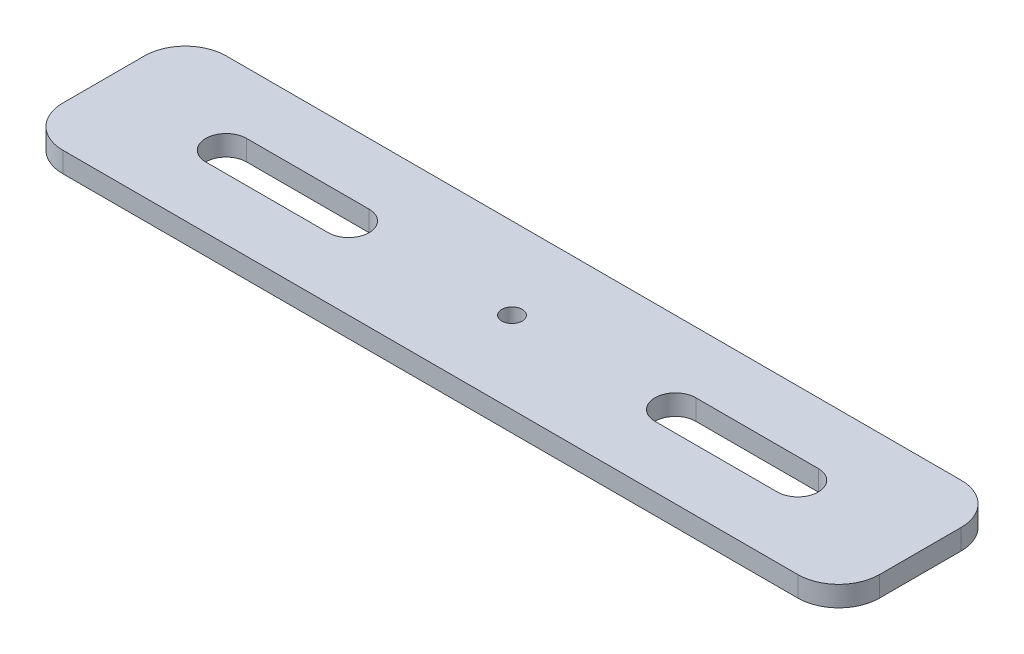
ISO-10303-21;
HEADER;
FILE_DESCRIPTION(('STEP AP214'),'2;1');
FILE_NAME('part.step','',(''),(''),'','','');
FILE_SCHEMA(('AUTOMOTIVE_DESIGN { 1 0 10303 214 1 1 1 1 }'));
ENDSEC;
DATA;
#1=APPLICATION_CONTEXT('core data for automotive mechanical design processes');
#2=APPLICATION_PROTOCOL_DEFINITION('international standard','automotive_design',2000,#1);
#3=PRODUCT_CONTEXT('',#1,'mechanical');
#4=PRODUCT('Part','Part','',(#3));
#5=PRODUCT_RELATED_PRODUCT_CATEGORY('part','',(#4));
#6=PRODUCT_DEFINITION_FORMATION('','',#4);
#7=PRODUCT_DEFINITION_CONTEXT('part definition',#1,'design');
#8=PRODUCT_DEFINITION('design','',#6,#7);
#9=PRODUCT_DEFINITION_SHAPE('','',#8);
#10=(LENGTH_UNIT() NAMED_UNIT(*) SI_UNIT(.MILLI.,.METRE.));
#11=(NAMED_UNIT(*) PLANE_ANGLE_UNIT() SI_UNIT($,.RADIAN.));
#12=(NAMED_UNIT(*) SI_UNIT($,.STERADIAN.) SOLID_ANGLE_UNIT());
#13=UNCERTAINTY_MEASURE_WITH_UNIT(LENGTH_MEASURE(1.E-05),#10,'distance_accuracy_value','');
#14=(GEOMETRIC_REPRESENTATION_CONTEXT(3) GLOBAL_UNCERTAINTY_ASSIGNED_CONTEXT((#13)) GLOBAL_UNIT_ASSIGNED_CONTEXT((#10,
#11,#12)) REPRESENTATION_CONTEXT('',''));
#15=CARTESIAN_POINT('',(0.,0.,0.));
#16=DIRECTION('',(0.,0.,1.));
#17=DIRECTION('',(1.,0.,0.));
#18=AXIS2_PLACEMENT_3D('',#15,#16,#17);
#19=CARTESIAN_POINT('',(70.,5.,0.));
#20=DIRECTION('',(0.,-1.,0.));
#21=DIRECTION('',(0.,0.,-1.));
#22=AXIS2_PLACEMENT_3D('',#19,#20,#21);
#23=CYLINDRICAL_SURFACE('',#22,5.);
#24=CARTESIAN_POINT('',(70.,0.,0.));
#25=DIRECTION('',(0.,1.,0.));
#26=DIRECTION('',(0.,0.,1.));
#27=AXIS2_PLACEMENT_3D('',#24,#25,#26);
#28=CIRCLE('',#27,5.);
#29=CARTESIAN_POINT('',(70.,0.,5.));
#30=VERTEX_POINT('',#29);
#31=CARTESIAN_POINT('',(70.,0.,-5.));
#32=VERTEX_POINT('',#31);
#33=EDGE_CURVE('E240',#30,#32,#28,.T.);
#34=ORIENTED_EDGE('',*,*,#33,.F.);
#35=DIRECTION('',(0.,-1.,0.));
#36=VECTOR('',#35,1.);
#37=CARTESIAN_POINT('',(70.,5.,5.));
#38=LINE('',#37,#36);
#39=CARTESIAN_POINT('',(70.,5.,5.));
#40=VERTEX_POINT('',#39);
#41=EDGE_CURVE('E11',#40,#30,#38,.T.);
#42=ORIENTED_EDGE('',*,*,#41,.F.);
#43=CARTESIAN_POINT('',(70.,5.,0.));
#44=DIRECTION('',(0.,1.,0.));
#45=DIRECTION('',(0.,0.,1.));
#46=AXIS2_PLACEMENT_3D('',#43,#44,#45);
#47=CIRCLE('',#46,5.);
#48=CARTESIAN_POINT('',(70.,5.,-5.));
#49=VERTEX_POINT('',#48);
#50=EDGE_CURVE('E179',#40,#49,#47,.T.);
#51=ORIENTED_EDGE('',*,*,#50,.T.);
#52=DIRECTION('',(0.,-1.,0.));
#53=VECTOR('',#52,1.);
#54=CARTESIAN_POINT('',(70.,5.,-5.));
#55=LINE('',#54,#53);
#56=EDGE_CURVE('E119',#49,#32,#55,.T.);
#57=ORIENTED_EDGE('',*,*,#56,.T.);
#58=EDGE_LOOP('',(#34,#42,#51,#57));
#59=FACE_BOUND('',#58,.T.);
#60=ADVANCED_FACE('F41',(#59),#23,.F.);
#61=CARTESIAN_POINT('',(0.,5.,5.));
#62=DIRECTION('',(0.,0.,-1.));
#63=DIRECTION('',(-1.,0.,0.));
#64=AXIS2_PLACEMENT_3D('',#61,#62,#63);
#65=PLANE('',#64);
#66=DIRECTION('',(1.,0.,0.));
#67=VECTOR('',#66,1.);
#68=CARTESIAN_POINT('',(0.,0.,5.));
#69=LINE('',#68,#67);
#70=CARTESIAN_POINT('',(40.,0.,5.));
#71=VERTEX_POINT('',#70);
#72=EDGE_CURVE('E170',#71,#30,#69,.T.);
#73=ORIENTED_EDGE('',*,*,#72,.F.);
#74=DIRECTION('',(0.,-1.,0.));
#75=VECTOR('',#74,1.);
#76=CARTESIAN_POINT('',(40.,5.,5.));
#77=LINE('',#76,#75);
#78=CARTESIAN_POINT('',(40.,5.,5.));
#79=VERTEX_POINT('',#78);
#80=EDGE_CURVE('E52',#79,#71,#77,.T.);
#81=ORIENTED_EDGE('',*,*,#80,.F.);
#82=DIRECTION('',(1.,0.,0.));
#83=VECTOR('',#82,1.);
#84=CARTESIAN_POINT('',(0.,5.,5.));
#85=LINE('',#84,#83);
#86=EDGE_CURVE('E168',#79,#40,#85,.T.);
#87=ORIENTED_EDGE('',*,*,#86,.T.);
#88=ORIENTED_EDGE('',*,*,#41,.T.);
#89=EDGE_LOOP('',(#73,#81,#87,#88));
#90=FACE_BOUND('',#89,.T.);
#91=ADVANCED_FACE('F167',(#90),#65,.T.);
#92=CARTESIAN_POINT('',(40.,5.,0.));
#93=DIRECTION('',(0.,-1.,0.));
#94=DIRECTION('',(0.,0.,-1.));
#95=AXIS2_PLACEMENT_3D('',#92,#93,#94);
#96=CYLINDRICAL_SURFACE('',#95,5.);
#97=CARTESIAN_POINT('',(40.,0.,0.));
#98=DIRECTION('',(0.,1.,0.));
#99=DIRECTION('',(0.,0.,1.));
#100=AXIS2_PLACEMENT_3D('',#97,#98,#99);
#101=CIRCLE('',#100,5.);
#102=CARTESIAN_POINT('',(40.,0.,-5.));
#103=VERTEX_POINT('',#102);
#104=EDGE_CURVE('E246',#103,#71,#101,.T.);
#105=ORIENTED_EDGE('',*,*,#104,.F.);
#106=DIRECTION('',(0.,-1.,0.));
#107=VECTOR('',#106,1.);
#108=CARTESIAN_POINT('',(40.,5.,-5.));
#109=LINE('',#108,#107);
#110=CARTESIAN_POINT('',(40.,5.,-5.));
#111=VERTEX_POINT('',#110);
#112=EDGE_CURVE('E112',#111,#103,#109,.T.);
#113=ORIENTED_EDGE('',*,*,#112,.F.);
#114=CARTESIAN_POINT('',(40.,5.,0.));
#115=DIRECTION('',(0.,1.,0.));
#116=DIRECTION('',(0.,0.,1.));
#117=AXIS2_PLACEMENT_3D('',#114,#115,#116);
#118=CIRCLE('',#117,5.);
#119=EDGE_CURVE('E178',#111,#79,#118,.T.);
#120=ORIENTED_EDGE('',*,*,#119,.T.);
#121=ORIENTED_EDGE('',*,*,#80,.T.);
#122=EDGE_LOOP('',(#105,#113,#120,#121));
#123=FACE_BOUND('',#122,.T.);
#124=ADVANCED_FACE('F182',(#123),#96,.F.);
#125=CARTESIAN_POINT('',(-100.,5.,0.));
#126=DIRECTION('',(1.,0.,0.));
#127=DIRECTION('',(0.,0.,-1.));
#128=AXIS2_PLACEMENT_3D('',#125,#126,#127);
#129=PLANE('',#128);
#130=DIRECTION('',(0.,0.,1.));
#131=VECTOR('',#130,1.);
#132=CARTESIAN_POINT('',(-100.,0.,0.));
#133=LINE('',#132,#131);
#134=CARTESIAN_POINT('',(-100.,0.,-9.9999999999999));
#135=VERTEX_POINT('',#134);
#136=CARTESIAN_POINT('',(-100.,0.,9.99999999999995));
#137=VERTEX_POINT('',#136);
#138=EDGE_CURVE('E206',#135,#137,#133,.T.);
#139=ORIENTED_EDGE('',*,*,#138,.T.);
#140=DIRECTION('',(0.,-1.,0.));
#141=VECTOR('',#140,1.);
#142=CARTESIAN_POINT('',(-100.,5.,9.99999999999995));
#143=LINE('',#142,#141);
#144=CARTESIAN_POINT('',(-100.,5.,9.99999999999995));
#145=VERTEX_POINT('',#144);
#146=EDGE_CURVE('E255',#145,#137,#143,.T.);
#147=ORIENTED_EDGE('',*,*,#146,.F.);
#148=DIRECTION('',(0.,0.,1.));
#149=VECTOR('',#148,1.);
#150=CARTESIAN_POINT('',(-100.,5.,0.));
#151=LINE('',#150,#149);
#152=CARTESIAN_POINT('',(-100.,5.,-9.9999999999999));
#153=VERTEX_POINT('',#152);
#154=EDGE_CURVE('E314',#153,#145,#151,.T.);
#155=ORIENTED_EDGE('',*,*,#154,.F.);
#156=DIRECTION('',(0.,-1.,0.));
#157=VECTOR('',#156,1.);
#158=CARTESIAN_POINT('',(-100.,5.,-9.9999999999999));
#159=LINE('',#158,#157);
#160=EDGE_CURVE('E258',#153,#135,#159,.T.);
#161=ORIENTED_EDGE('',*,*,#160,.T.);
#162=EDGE_LOOP('',(#139,#147,#155,#161));
#163=FACE_BOUND('',#162,.T.);
#164=ADVANCED_FACE('F404',(#163),#129,.F.);
#165=CARTESIAN_POINT('',(-90.,5.,10.));
#166=DIRECTION('',(0.,-1.,0.));
#167=DIRECTION('',(0.,0.,-1.));
#168=AXIS2_PLACEMENT_3D('',#165,#166,#167);
#169=CYLINDRICAL_SURFACE('',#168,9.99999999999999);
#170=CARTESIAN_POINT('',(-90.,0.,10.));
#171=DIRECTION('',(0.,1.,0.));
#172=DIRECTION('',(0.,0.,1.));
#173=AXIS2_PLACEMENT_3D('',#170,#171,#172);
#174=CIRCLE('',#173,9.99999999999999);
#175=CARTESIAN_POINT('',(-89.9999999999999,0.,20.));
#176=VERTEX_POINT('',#175);
#177=EDGE_CURVE('E210',#137,#176,#174,.T.);
#178=ORIENTED_EDGE('',*,*,#177,.T.);
#179=DIRECTION('',(0.,-1.,0.));
#180=VECTOR('',#179,1.);
#181=CARTESIAN_POINT('',(-89.9999999999999,5.,20.));
#182=LINE('',#181,#180);
#183=CARTESIAN_POINT('',(-89.9999999999999,5.,20.));
#184=VERTEX_POINT('',#183);
#185=EDGE_CURVE('E278',#184,#176,#182,.T.);
#186=ORIENTED_EDGE('',*,*,#185,.F.);
#187=CARTESIAN_POINT('',(-90.,5.,10.));
#188=DIRECTION('',(0.,1.,0.));
#189=DIRECTION('',(0.,0.,1.));
#190=AXIS2_PLACEMENT_3D('',#187,#188,#189);
#191=CIRCLE('',#190,9.99999999999999);
#192=EDGE_CURVE('E326',#145,#184,#191,.T.);
#193=ORIENTED_EDGE('',*,*,#192,.F.);
#194=ORIENTED_EDGE('',*,*,#146,.T.);
#195=EDGE_LOOP('',(#178,#186,#193,#194));
#196=FACE_BOUND('',#195,.T.);
#197=ADVANCED_FACE('F400',(#196),#169,.T.);
#198=CARTESIAN_POINT('',(0.,5.,20.));
#199=DIRECTION('',(0.,0.,1.));
#200=DIRECTION('',(1.,0.,0.));
#201=AXIS2_PLACEMENT_3D('',#198,#199,#200);
#202=PLANE('',#201);
#203=DIRECTION('',(-1.,0.,0.));
#204=VECTOR('',#203,1.);
#205=CARTESIAN_POINT('',(0.,0.,20.));
#206=LINE('',#205,#204);
#207=CARTESIAN_POINT('',(89.9999999999999,0.,20.));
#208=VERTEX_POINT('',#207);
#209=EDGE_CURVE('E214',#208,#176,#206,.T.);
#210=ORIENTED_EDGE('',*,*,#209,.F.);
#211=DIRECTION('',(0.,-1.,0.));
#212=VECTOR('',#211,1.);
#213=CARTESIAN_POINT('',(89.9999999999999,5.,20.));
#214=LINE('',#213,#212);
#215=CARTESIAN_POINT('',(89.9999999999999,5.,20.));
#216=VERTEX_POINT('',#215);
#217=EDGE_CURVE('E275',#216,#208,#214,.T.);
#218=ORIENTED_EDGE('',*,*,#217,.F.);
#219=DIRECTION('',(-1.,0.,0.));
#220=VECTOR('',#219,1.);
#221=CARTESIAN_POINT('',(0.,5.,20.));
#222=LINE('',#221,#220);
#223=EDGE_CURVE('E329',#216,#184,#222,.T.);
#224=ORIENTED_EDGE('',*,*,#223,.T.);
#225=ORIENTED_EDGE('',*,*,#185,.T.);
#226=EDGE_LOOP('',(#210,#218,#224,#225));
#227=FACE_BOUND('',#226,.T.);
#228=ADVANCED_FACE('F396',(#227),#202,.T.);
#229=CARTESIAN_POINT('',(90.,5.,9.99999999999998));
#230=DIRECTION('',(0.,-1.,0.));
#231=DIRECTION('',(0.,0.,-1.));
#232=AXIS2_PLACEMENT_3D('',#229,#230,#231);
#233=CYLINDRICAL_SURFACE('',#232,10.);
#234=CARTESIAN_POINT('',(90.,0.,9.99999999999998));
#235=DIRECTION('',(0.,1.,0.));
#236=DIRECTION('',(0.,0.,1.));
#237=AXIS2_PLACEMENT_3D('',#234,#235,#236);
#238=CIRCLE('',#237,10.);
#239=CARTESIAN_POINT('',(100.,0.,9.99999999999991));
#240=VERTEX_POINT('',#239);
#241=EDGE_CURVE('E218',#208,#240,#238,.T.);
#242=ORIENTED_EDGE('',*,*,#241,.T.);
#243=DIRECTION('',(0.,-1.,0.));
#244=VECTOR('',#243,1.);
#245=CARTESIAN_POINT('',(100.,5.,9.99999999999991));
#246=LINE('',#245,#244);
#247=CARTESIAN_POINT('',(100.,5.,9.99999999999991));
#248=VERTEX_POINT('',#247);
#249=EDGE_CURVE('E272',#248,#240,#246,.T.);
#250=ORIENTED_EDGE('',*,*,#249,.F.);
#251=CARTESIAN_POINT('',(90.,5.,9.99999999999998));
#252=DIRECTION('',(0.,1.,0.));
#253=DIRECTION('',(0.,0.,1.));
#254=AXIS2_PLACEMENT_3D('',#251,#252,#253);
#255=CIRCLE('',#254,10.);
#256=EDGE_CURVE('E333',#216,#248,#255,.T.);
#257=ORIENTED_EDGE('',*,*,#256,.F.);
#258=ORIENTED_EDGE('',*,*,#217,.T.);
#259=EDGE_LOOP('',(#242,#250,#257,#258));
#260=FACE_BOUND('',#259,.T.);
#261=ADVANCED_FACE('F392',(#260),#233,.T.);
#262=CARTESIAN_POINT('',(100.,5.,0.));
#263=DIRECTION('',(1.,0.,0.));
#264=DIRECTION('',(0.,0.,-1.));
#265=AXIS2_PLACEMENT_3D('',#262,#263,#264);
#266=PLANE('',#265);
#267=DIRECTION('',(0.,0.,1.));
#268=VECTOR('',#267,1.);
#269=CARTESIAN_POINT('',(100.,0.,0.));
#270=LINE('',#269,#268);
#271=CARTESIAN_POINT('',(100.,0.,-9.99999999999995));
#272=VERTEX_POINT('',#271);
#273=EDGE_CURVE('E222',#272,#240,#270,.T.);
#274=ORIENTED_EDGE('',*,*,#273,.F.);
#275=DIRECTION('',(0.,-1.,0.));
#276=VECTOR('',#275,1.);
#277=CARTESIAN_POINT('',(100.,5.,-9.99999999999995));
#278=LINE('',#277,#276);
#279=CARTESIAN_POINT('',(100.,5.,-9.99999999999995));
#280=VERTEX_POINT('',#279);
#281=EDGE_CURVE('E269',#280,#272,#278,.T.);
#282=ORIENTED_EDGE('',*,*,#281,.F.);
#283=DIRECTION('',(0.,0.,1.));
#284=VECTOR('',#283,1.);
#285=CARTESIAN_POINT('',(100.,5.,0.));
#286=LINE('',#285,#284);
#287=EDGE_CURVE('E336',#280,#248,#286,.T.);
#288=ORIENTED_EDGE('',*,*,#287,.T.);
#289=ORIENTED_EDGE('',*,*,#249,.T.);
#290=EDGE_LOOP('',(#274,#282,#288,#289));
#291=FACE_BOUND('',#290,.T.);
#292=ADVANCED_FACE('F388',(#291),#266,.T.);
#293=CARTESIAN_POINT('',(90.,5.,-10.));
#294=DIRECTION('',(0.,-1.,0.));
#295=DIRECTION('',(0.,0.,-1.));
#296=AXIS2_PLACEMENT_3D('',#293,#294,#295);
#297=CYLINDRICAL_SURFACE('',#296,10.);
#298=CARTESIAN_POINT('',(90.,0.,-10.));
#299=DIRECTION('',(0.,1.,0.));
#300=DIRECTION('',(0.,0.,1.));
#301=AXIS2_PLACEMENT_3D('',#298,#299,#300);
#302=CIRCLE('',#301,10.);
#303=CARTESIAN_POINT('',(89.9999999999999,0.,-20.));
#304=VERTEX_POINT('',#303);
#305=EDGE_CURVE('E226',#304,#272,#302,.F.);
#306=ORIENTED_EDGE('',*,*,#305,.F.);
#307=DIRECTION('',(0.,-1.,0.));
#308=VECTOR('',#307,1.);
#309=CARTESIAN_POINT('',(89.9999999999999,5.,-20.));
#310=LINE('',#309,#308);
#311=CARTESIAN_POINT('',(89.9999999999999,5.,-20.));
#312=VERTEX_POINT('',#311);
#313=EDGE_CURVE('E266',#312,#304,#310,.T.);
#314=ORIENTED_EDGE('',*,*,#313,.F.);
#315=CARTESIAN_POINT('',(90.,5.,-10.));
#316=DIRECTION('',(0.,1.,0.));
#317=DIRECTION('',(0.,0.,1.));
#318=AXIS2_PLACEMENT_3D('',#315,#316,#317);
#319=CIRCLE('',#318,10.);
#320=EDGE_CURVE('E340',#312,#280,#319,.F.);
#321=ORIENTED_EDGE('',*,*,#320,.T.);
#322=ORIENTED_EDGE('',*,*,#281,.T.);
#323=EDGE_LOOP('',(#306,#314,#321,#322));
#324=FACE_BOUND('',#323,.T.);
#325=ADVANCED_FACE('F384',(#324),#297,.T.);
#326=CARTESIAN_POINT('',(0.,5.,-20.));
#327=DIRECTION('',(0.,0.,1.));
#328=DIRECTION('',(1.,0.,0.));
#329=AXIS2_PLACEMENT_3D('',#326,#327,#328);
#330=PLANE('',#329);
#331=DIRECTION('',(-1.,0.,0.));
#332=VECTOR('',#331,1.);
#333=CARTESIAN_POINT('',(0.,0.,-20.));
#334=LINE('',#333,#332);
#335=CARTESIAN_POINT('',(-89.9999999999999,0.,-20.));
#336=VERTEX_POINT('',#335);
#337=EDGE_CURVE('E230',#304,#336,#334,.T.);
#338=ORIENTED_EDGE('',*,*,#337,.T.);
#339=DIRECTION('',(0.,-1.,0.));
#340=VECTOR('',#339,1.);
#341=CARTESIAN_POINT('',(-89.9999999999999,5.,-20.));
#342=LINE('',#341,#340);
#343=CARTESIAN_POINT('',(-89.9999999999999,5.,-20.));
#344=VERTEX_POINT('',#343);
#345=EDGE_CURVE('E262',#344,#336,#342,.T.);
#346=ORIENTED_EDGE('',*,*,#345,.F.);
#347=DIRECTION('',(-1.,0.,0.));
#348=VECTOR('',#347,1.);
#349=CARTESIAN_POINT('',(0.,5.,-20.));
#350=LINE('',#349,#348);
#351=EDGE_CURVE('E344',#312,#344,#350,.T.);
#352=ORIENTED_EDGE('',*,*,#351,.F.);
#353=ORIENTED_EDGE('',*,*,#313,.T.);
#354=EDGE_LOOP('',(#338,#346,#352,#353));
#355=FACE_BOUND('',#354,.T.);
#356=ADVANCED_FACE('F381',(#355),#330,.F.);
#357=CARTESIAN_POINT('',(-70.,5.,0.));
#358=DIRECTION('',(0.,-1.,0.));
#359=DIRECTION('',(0.,0.,-1.));
#360=AXIS2_PLACEMENT_3D('',#357,#358,#359);
#361=CYLINDRICAL_SURFACE('',#360,5.00000000000001);
#362=CARTESIAN_POINT('',(-70.,0.,0.));
#363=DIRECTION('',(0.,1.,0.));
#364=DIRECTION('',(0.,0.,1.));
#365=AXIS2_PLACEMENT_3D('',#362,#363,#364);
#366=CIRCLE('',#365,5.00000000000001);
#367=CARTESIAN_POINT('',(-70.,0.,-5.));
#368=VERTEX_POINT('',#367);
#369=CARTESIAN_POINT('',(-70.,0.,5.00000000000001));
#370=VERTEX_POINT('',#369);
#371=EDGE_CURVE('E190',#368,#370,#366,.T.);
#372=ORIENTED_EDGE('',*,*,#371,.F.);
#373=DIRECTION('',(0.,-1.,0.));
#374=VECTOR('',#373,1.);
#375=CARTESIAN_POINT('',(-70.,5.,-5.));
#376=LINE('',#375,#374);
#377=CARTESIAN_POINT('',(-70.,5.,-5.));
#378=VERTEX_POINT('',#377);
#379=EDGE_CURVE('E45',#378,#368,#376,.T.);
#380=ORIENTED_EDGE('',*,*,#379,.F.);
#381=CARTESIAN_POINT('',(-70.,5.,0.));
#382=DIRECTION('',(0.,1.,0.));
#383=DIRECTION('',(0.,0.,1.));
#384=AXIS2_PLACEMENT_3D('',#381,#382,#383);
#385=CIRCLE('',#384,5.00000000000001);
#386=CARTESIAN_POINT('',(-70.,5.,5.00000000000001));
#387=VERTEX_POINT('',#386);
#388=EDGE_CURVE('E252',#378,#387,#385,.T.);
#389=ORIENTED_EDGE('',*,*,#388,.T.);
#390=DIRECTION('',(0.,-1.,0.));
#391=VECTOR('',#390,1.);
#392=CARTESIAN_POINT('',(-70.,5.,5.00000000000001));
#393=LINE('',#392,#391);
#394=EDGE_CURVE('E186',#387,#370,#393,.T.);
#395=ORIENTED_EDGE('',*,*,#394,.T.);
#396=EDGE_LOOP('',(#372,#380,#389,#395));
#397=FACE_BOUND('',#396,.T.);
#398=ADVANCED_FACE('F43',(#397),#361,.F.);
#399=CARTESIAN_POINT('',(0.,5.,-5.00000000000001));
#400=DIRECTION('',(0.,0.,1.));
#401=DIRECTION('',(1.,0.,0.));
#402=AXIS2_PLACEMENT_3D('',#399,#400,#401);
#403=PLANE('',#402);
#404=DIRECTION('',(-1.,0.,0.));
#405=VECTOR('',#404,1.);
#406=CARTESIAN_POINT('',(0.,0.,-5.00000000000001));
#407=LINE('',#406,#405);
#408=CARTESIAN_POINT('',(-40.,0.,-5.00000000000001));
#409=VERTEX_POINT('',#408);
#410=EDGE_CURVE('E194',#409,#368,#407,.T.);
#411=ORIENTED_EDGE('',*,*,#410,.F.);
#412=DIRECTION('',(0.,-1.,0.));
#413=VECTOR('',#412,1.);
#414=CARTESIAN_POINT('',(-40.,5.,-5.00000000000001));
#415=LINE('',#414,#413);
#416=CARTESIAN_POINT('',(-40.,5.,-5.00000000000001));
#417=VERTEX_POINT('',#416);
#418=EDGE_CURVE('E288',#417,#409,#415,.T.);
#419=ORIENTED_EDGE('',*,*,#418,.F.);
#420=DIRECTION('',(-1.,0.,0.));
#421=VECTOR('',#420,1.);
#422=CARTESIAN_POINT('',(0.,5.,-5.00000000000001));
#423=LINE('',#422,#421);
#424=EDGE_CURVE('E299',#417,#378,#423,.T.);
#425=ORIENTED_EDGE('',*,*,#424,.T.);
#426=ORIENTED_EDGE('',*,*,#379,.T.);
#427=EDGE_LOOP('',(#411,#419,#425,#426));
#428=FACE_BOUND('',#427,.T.);
#429=ADVANCED_FACE('F297',(#428),#403,.T.);
#430=CARTESIAN_POINT('',(-40.,5.,0.));
#431=DIRECTION('',(0.,-1.,0.));
#432=DIRECTION('',(0.,0.,-1.));
#433=AXIS2_PLACEMENT_3D('',#430,#431,#432);
#434=CYLINDRICAL_SURFACE('',#433,5.00000000000001);
#435=CARTESIAN_POINT('',(-40.,0.,0.));
#436=DIRECTION('',(0.,1.,0.));
#437=DIRECTION('',(0.,0.,1.));
#438=AXIS2_PLACEMENT_3D('',#435,#436,#437);
#439=CIRCLE('',#438,5.00000000000001);
#440=CARTESIAN_POINT('',(-40.,0.,5.00000000000001));
#441=VERTEX_POINT('',#440);
#442=EDGE_CURVE('E198',#441,#409,#439,.T.);
#443=ORIENTED_EDGE('',*,*,#442,.F.);
#444=DIRECTION('',(0.,-1.,0.));
#445=VECTOR('',#444,1.);
#446=CARTESIAN_POINT('',(-40.,5.,5.00000000000001));
#447=LINE('',#446,#445);
#448=CARTESIAN_POINT('',(-40.,5.,5.00000000000001));
#449=VERTEX_POINT('',#448);
#450=EDGE_CURVE('E286',#449,#441,#447,.T.);
#451=ORIENTED_EDGE('',*,*,#450,.F.);
#452=CARTESIAN_POINT('',(-40.,5.,0.));
#453=DIRECTION('',(0.,1.,0.));
#454=DIRECTION('',(0.,0.,1.));
#455=AXIS2_PLACEMENT_3D('',#452,#453,#454);
#456=CIRCLE('',#455,5.00000000000001);
#457=EDGE_CURVE('E308',#449,#417,#456,.T.);
#458=ORIENTED_EDGE('',*,*,#457,.T.);
#459=ORIENTED_EDGE('',*,*,#418,.T.);
#460=EDGE_LOOP('',(#443,#451,#458,#459));
#461=FACE_BOUND('',#460,.T.);
#462=ADVANCED_FACE('F305',(#461),#434,.F.);
#463=CARTESIAN_POINT('',(0.,5.,0.));
#464=DIRECTION('',(0.,-1.,0.));
#465=DIRECTION('',(0.,0.,-1.));
#466=AXIS2_PLACEMENT_3D('',#463,#464,#465);
#467=CYLINDRICAL_SURFACE('',#466,2.5);
#468=CARTESIAN_POINT('',(0.,5.,0.));
#469=DIRECTION('',(0.,1.,0.));
#470=DIRECTION('',(0.,0.,1.));
#471=AXIS2_PLACEMENT_3D('',#468,#469,#470);
#472=CIRCLE('',#471,2.5);
#473=CARTESIAN_POINT('',(0.,5.,2.50000000000001));
#474=VERTEX_POINT('',#473);
#475=EDGE_CURVE('E350',#474,#474,#472,.T.);
#476=ORIENTED_EDGE('',*,*,#475,.T.);
#477=EDGE_LOOP('',(#476));
#478=FACE_BOUND('',#477,.T.);
#479=CARTESIAN_POINT('',(0.,0.,0.));
#480=DIRECTION('',(0.,1.,0.));
#481=DIRECTION('',(0.,0.,1.));
#482=AXIS2_PLACEMENT_3D('',#479,#480,#481);
#483=CIRCLE('',#482,2.5);
#484=CARTESIAN_POINT('',(0.,0.,2.50000000000001));
#485=VERTEX_POINT('',#484);
#486=EDGE_CURVE('E236',#485,#485,#483,.T.);
#487=ORIENTED_EDGE('',*,*,#486,.F.);
#488=EDGE_LOOP('',(#487));
#489=FACE_BOUND('',#488,.T.);
#490=ADVANCED_FACE('F374',(#478,#489),#467,.F.);
#491=CARTESIAN_POINT('',(-90.,5.,-9.99999999999997));
#492=DIRECTION('',(0.,-1.,0.));
#493=DIRECTION('',(0.,0.,-1.));
#494=AXIS2_PLACEMENT_3D('',#491,#492,#493);
#495=CYLINDRICAL_SURFACE('',#494,10.);
#496=CARTESIAN_POINT('',(-90.,0.,-9.99999999999997));
#497=DIRECTION('',(0.,1.,0.));
#498=DIRECTION('',(0.,0.,1.));
#499=AXIS2_PLACEMENT_3D('',#496,#497,#498);
#500=CIRCLE('',#499,10.);
#501=EDGE_CURVE('E233',#336,#135,#500,.T.);
#502=ORIENTED_EDGE('',*,*,#501,.T.);
#503=ORIENTED_EDGE('',*,*,#160,.F.);
#504=CARTESIAN_POINT('',(-90.,5.,-9.99999999999997));
#505=DIRECTION('',(0.,1.,0.));
#506=DIRECTION('',(0.,0.,1.));
#507=AXIS2_PLACEMENT_3D('',#504,#505,#506);
#508=CIRCLE('',#507,10.);
#509=EDGE_CURVE('E347',#344,#153,#508,.T.);
#510=ORIENTED_EDGE('',*,*,#509,.F.);
#511=ORIENTED_EDGE('',*,*,#345,.T.);
#512=EDGE_LOOP('',(#502,#503,#510,#511));
#513=FACE_BOUND('',#512,.T.);
#514=ADVANCED_FACE('F363',(#513),#495,.T.);
#515=CARTESIAN_POINT('',(0.,5.,5.));
#516=DIRECTION('',(0.,0.,1.));
#517=DIRECTION('',(1.,0.,0.));
#518=AXIS2_PLACEMENT_3D('',#515,#516,#517);
#519=PLANE('',#518);
#520=DIRECTION('',(-1.,0.,0.));
#521=VECTOR('',#520,1.);
#522=CARTESIAN_POINT('',(0.,0.,5.));
#523=LINE('',#522,#521);
#524=EDGE_CURVE('E202',#441,#370,#523,.T.);
#525=ORIENTED_EDGE('',*,*,#524,.T.);
#526=ORIENTED_EDGE('',*,*,#394,.F.);
#527=DIRECTION('',(-1.,0.,0.));
#528=VECTOR('',#527,1.);
#529=CARTESIAN_POINT('',(0.,5.,5.));
#530=LINE('',#529,#528);
#531=EDGE_CURVE('E310',#449,#387,#530,.T.);
#532=ORIENTED_EDGE('',*,*,#531,.F.);
#533=ORIENTED_EDGE('',*,*,#450,.T.);
#534=EDGE_LOOP('',(#525,#526,#532,#533));
#535=FACE_BOUND('',#534,.T.);
#536=ADVANCED_FACE('F311',(#535),#519,.F.);
#537=CARTESIAN_POINT('',(0.,5.,-5.));
#538=DIRECTION('',(0.,0.,-1.));
#539=DIRECTION('',(-1.,0.,0.));
#540=AXIS2_PLACEMENT_3D('',#537,#538,#539);
#541=PLANE('',#540);
#542=DIRECTION('',(1.,0.,0.));
#543=VECTOR('',#542,1.);
#544=CARTESIAN_POINT('',(0.,0.,-5.));
#545=LINE('',#544,#543);
#546=EDGE_CURVE('E249',#103,#32,#545,.T.);
#547=ORIENTED_EDGE('',*,*,#546,.T.);
#548=ORIENTED_EDGE('',*,*,#56,.F.);
#549=DIRECTION('',(1.,0.,0.));
#550=VECTOR('',#549,1.);
#551=CARTESIAN_POINT('',(0.,5.,-5.));
#552=LINE('',#551,#550);
#553=EDGE_CURVE('E61',#111,#49,#552,.T.);
#554=ORIENTED_EDGE('',*,*,#553,.F.);
#555=ORIENTED_EDGE('',*,*,#112,.T.);
#556=EDGE_LOOP('',(#547,#548,#554,#555));
#557=FACE_BOUND('',#556,.T.);
#558=ADVANCED_FACE('F355',(#557),#541,.F.);
#559=CARTESIAN_POINT('',(0.,5.,0.));
#560=DIRECTION('',(0.,1.,0.));
#561=DIRECTION('',(0.,0.,1.));
#562=AXIS2_PLACEMENT_3D('',#559,#560,#561);
#563=PLANE('',#562);
#564=ORIENTED_EDGE('',*,*,#388,.F.);
#565=ORIENTED_EDGE('',*,*,#424,.F.);
#566=ORIENTED_EDGE('',*,*,#457,.F.);
#567=ORIENTED_EDGE('',*,*,#531,.T.);
#568=EDGE_LOOP('',(#564,#565,#566,#567));
#569=FACE_BOUND('',#568,.T.);
#570=ORIENTED_EDGE('',*,*,#154,.T.);
#571=ORIENTED_EDGE('',*,*,#192,.T.);
#572=ORIENTED_EDGE('',*,*,#223,.F.);
#573=ORIENTED_EDGE('',*,*,#256,.T.);
#574=ORIENTED_EDGE('',*,*,#287,.F.);
#575=ORIENTED_EDGE('',*,*,#320,.F.);
#576=ORIENTED_EDGE('',*,*,#351,.T.);
#577=ORIENTED_EDGE('',*,*,#509,.T.);
#578=EDGE_LOOP('',(#570,#571,#572,#573,#574,#575,#576,#577));
#579=FACE_BOUND('',#578,.T.);
#580=ORIENTED_EDGE('',*,*,#475,.F.);
#581=EDGE_LOOP('',(#580));
#582=FACE_BOUND('',#581,.T.);
#583=ORIENTED_EDGE('',*,*,#50,.F.);
#584=ORIENTED_EDGE('',*,*,#86,.F.);
#585=ORIENTED_EDGE('',*,*,#119,.F.);
#586=ORIENTED_EDGE('',*,*,#553,.T.);
#587=EDGE_LOOP('',(#583,#584,#585,#586));
#588=FACE_BOUND('',#587,.T.);
#589=ADVANCED_FACE('F177',(#569,#579,#582,#588),#563,.T.);
#590=CARTESIAN_POINT('',(0.,0.,0.));
#591=DIRECTION('',(0.,1.,0.));
#592=DIRECTION('',(0.,0.,1.));
#593=AXIS2_PLACEMENT_3D('',#590,#591,#592);
#594=PLANE('',#593);
#595=ORIENTED_EDGE('',*,*,#371,.T.);
#596=ORIENTED_EDGE('',*,*,#524,.F.);
#597=ORIENTED_EDGE('',*,*,#442,.T.);
#598=ORIENTED_EDGE('',*,*,#410,.T.);
#599=EDGE_LOOP('',(#595,#596,#597,#598));
#600=FACE_BOUND('',#599,.T.);
#601=ORIENTED_EDGE('',*,*,#138,.F.);
#602=ORIENTED_EDGE('',*,*,#501,.F.);
#603=ORIENTED_EDGE('',*,*,#337,.F.);
#604=ORIENTED_EDGE('',*,*,#305,.T.);
#605=ORIENTED_EDGE('',*,*,#273,.T.);
#606=ORIENTED_EDGE('',*,*,#241,.F.);
#607=ORIENTED_EDGE('',*,*,#209,.T.);
#608=ORIENTED_EDGE('',*,*,#177,.F.);
#609=EDGE_LOOP('',(#601,#602,#603,#604,#605,#606,#607,#608));
#610=FACE_BOUND('',#609,.T.);
#611=ORIENTED_EDGE('',*,*,#486,.T.);
#612=EDGE_LOOP('',(#611));
#613=FACE_BOUND('',#612,.T.);
#614=ORIENTED_EDGE('',*,*,#33,.T.);
#615=ORIENTED_EDGE('',*,*,#546,.F.);
#616=ORIENTED_EDGE('',*,*,#104,.T.);
#617=ORIENTED_EDGE('',*,*,#72,.T.);
#618=EDGE_LOOP('',(#614,#615,#616,#617));
#619=FACE_BOUND('',#618,.T.);
#620=ADVANCED_FACE('F303',(#600,#610,#613,#619),#594,.F.);
#621=CLOSED_SHELL('',(#60,#91,#124,#164,#197,#228,#261,#292,#325,#356,#398,#429,#462,#490,#514,
#536,#558,#589,#620));
#622=MANIFOLD_SOLID_BREP('B2',#621);
#623=ADVANCED_BREP_SHAPE_REPRESENTATION('',(#18,#622),#14);
#624=SHAPE_DEFINITION_REPRESENTATION(#9,#623);
ENDSEC;
END-ISO-10303-21;
